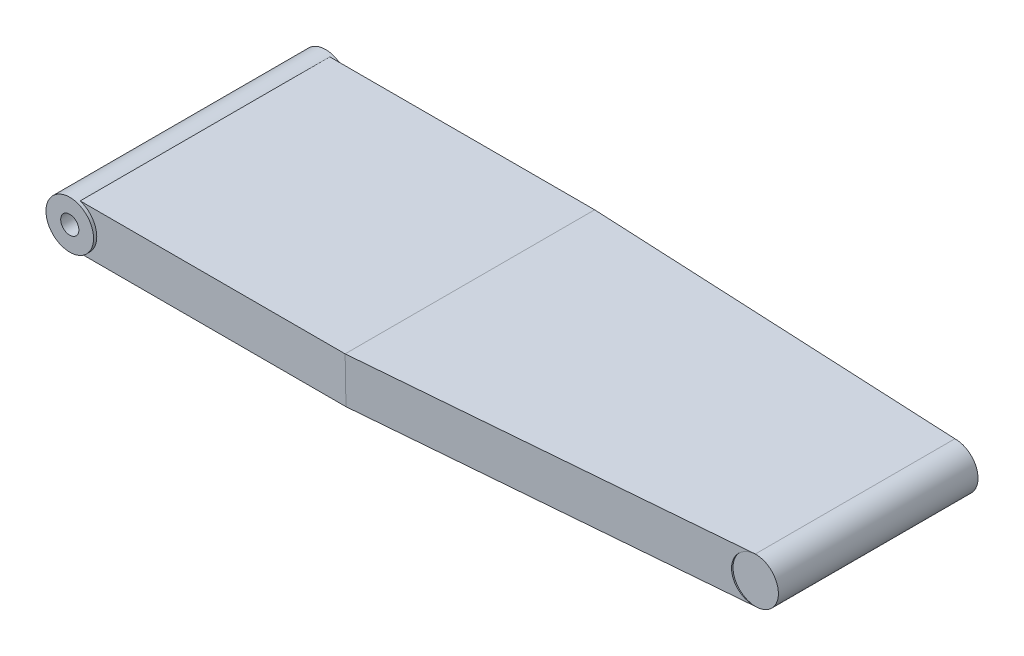
ISO-10303-21;
HEADER;
FILE_DESCRIPTION(('STEP AP214'),'2;1');
FILE_NAME('part.step','',(''),(''),'','','');
FILE_SCHEMA(('AUTOMOTIVE_DESIGN { 1 0 10303 214 1 1 1 1 }'));
ENDSEC;
DATA;
#1=APPLICATION_CONTEXT('core data for automotive mechanical design processes');
#2=APPLICATION_PROTOCOL_DEFINITION('international standard','automotive_design',2000,#1);
#3=PRODUCT_CONTEXT('',#1,'mechanical');
#4=PRODUCT('Part','Part','',(#3));
#5=PRODUCT_RELATED_PRODUCT_CATEGORY('part','',(#4));
#6=PRODUCT_DEFINITION_FORMATION('','',#4);
#7=PRODUCT_DEFINITION_CONTEXT('part definition',#1,'design');
#8=PRODUCT_DEFINITION('design','',#6,#7);
#9=PRODUCT_DEFINITION_SHAPE('','',#8);
#10=(LENGTH_UNIT() NAMED_UNIT(*) SI_UNIT(.MILLI.,.METRE.));
#11=(NAMED_UNIT(*) PLANE_ANGLE_UNIT() SI_UNIT($,.RADIAN.));
#12=(NAMED_UNIT(*) SI_UNIT($,.STERADIAN.) SOLID_ANGLE_UNIT());
#13=UNCERTAINTY_MEASURE_WITH_UNIT(LENGTH_MEASURE(1.E-05),#10,'distance_accuracy_value','');
#14=(GEOMETRIC_REPRESENTATION_CONTEXT(3) GLOBAL_UNCERTAINTY_ASSIGNED_CONTEXT((#13)) GLOBAL_UNIT_ASSIGNED_CONTEXT((#10,
#11,#12)) REPRESENTATION_CONTEXT('',''));
#15=CARTESIAN_POINT('',(0.,0.,0.));
#16=DIRECTION('',(0.,0.,1.));
#17=DIRECTION('',(1.,0.,0.));
#18=AXIS2_PLACEMENT_3D('',#15,#16,#17);
#19=CARTESIAN_POINT('',(145.,1.50077929514975,22.));
#20=DIRECTION('',(0.,0.,-1.));
#21=DIRECTION('',(-1.,0.,0.));
#22=AXIS2_PLACEMENT_3D('',#19,#20,#21);
#23=CYLINDRICAL_SURFACE('',#22,5.00000000000002);
#24=DIRECTION('',(0.,0.,-1.));
#25=VECTOR('',#24,1.);
#26=CARTESIAN_POINT('',(144.911732622259,6.50000012144126,27.5));
#27=LINE('',#26,#25);
#28=CARTESIAN_POINT('',(144.911732622259,6.50000012144126,22.));
#29=VERTEX_POINT('',#28);
#30=CARTESIAN_POINT('',(144.911732622259,6.50000012144126,-22.));
#31=VERTEX_POINT('',#30);
#32=EDGE_CURVE('E126',#29,#31,#27,.T.);
#33=ORIENTED_EDGE('',*,*,#32,.F.);
#34=CARTESIAN_POINT('',(145.,1.50077929514975,22.));
#35=DIRECTION('',(0.,0.,1.));
#36=DIRECTION('',(1.,0.,0.));
#37=AXIS2_PLACEMENT_3D('',#34,#35,#36);
#38=CIRCLE('',#37,5.00000000000002);
#39=CARTESIAN_POINT('',(145.088267377741,-3.49844153114175,22.));
#40=VERTEX_POINT('',#39);
#41=EDGE_CURVE('E171',#40,#29,#38,.T.);
#42=ORIENTED_EDGE('',*,*,#41,.F.);
#43=DIRECTION('',(0.,0.,-1.));
#44=VECTOR('',#43,1.);
#45=CARTESIAN_POINT('',(145.088267377741,-3.49844153114175,27.5));
#46=LINE('',#45,#44);
#47=CARTESIAN_POINT('',(145.088267377741,-3.49844153114175,-22.));
#48=VERTEX_POINT('',#47);
#49=EDGE_CURVE('E161',#40,#48,#46,.T.);
#50=ORIENTED_EDGE('',*,*,#49,.T.);
#51=CARTESIAN_POINT('',(145.,1.50077929514975,-22.));
#52=DIRECTION('',(0.,0.,1.));
#53=DIRECTION('',(1.,0.,0.));
#54=AXIS2_PLACEMENT_3D('',#51,#52,#53);
#55=CIRCLE('',#54,5.00000000000002);
#56=EDGE_CURVE('E167',#48,#31,#55,.T.);
#57=ORIENTED_EDGE('',*,*,#56,.T.);
#58=EDGE_LOOP('',(#33,#42,#50,#57));
#59=FACE_BOUND('',#58,.T.);
#60=ADVANCED_FACE('F48',(#59),#23,.T.);
#61=CARTESIAN_POINT('',(0.,0.,22.));
#62=DIRECTION('',(0.,0.,1.));
#63=DIRECTION('',(1.,0.,0.));
#64=AXIS2_PLACEMENT_3D('',#61,#62,#63);
#65=PLANE('',#64);
#66=ORIENTED_EDGE('',*,*,#41,.T.);
#67=EDGE_CURVE('E168',#29,#40,#38,.T.);
#68=ORIENTED_EDGE('',*,*,#67,.T.);
#69=EDGE_LOOP('',(#66,#68));
#70=FACE_BOUND('',#69,.T.);
#71=ADVANCED_FACE('F209',(#70),#65,.T.);
#72=CARTESIAN_POINT('',(0.,0.,-22.));
#73=DIRECTION('',(0.,0.,1.));
#74=DIRECTION('',(1.,0.,0.));
#75=AXIS2_PLACEMENT_3D('',#72,#73,#74);
#76=PLANE('',#75);
#77=EDGE_CURVE('E172',#31,#48,#55,.T.);
#78=ORIENTED_EDGE('',*,*,#77,.F.);
#79=ORIENTED_EDGE('',*,*,#56,.F.);
#80=EDGE_LOOP('',(#78,#79));
#81=FACE_BOUND('',#80,.T.);
#82=ADVANCED_FACE('F196',(#81),#76,.F.);
#83=CARTESIAN_POINT('',(145.,1.50077929514975,27.5));
#84=DIRECTION('',(0.,0.,-1.));
#85=DIRECTION('',(-1.,0.,0.));
#86=AXIS2_PLACEMENT_3D('',#83,#84,#85);
#87=CYLINDRICAL_SURFACE('',#86,5.00000000000002);
#88=CARTESIAN_POINT('',(145.,1.50077929514975,-22.));
#89=DIRECTION('',(-0.0646175896619117,-0.00114090283137741,0.997909447518669));
#90=DIRECTION('',(-0.997753938557676,-0.0176165700310762,-0.0646276608967542));
#91=AXIS2_PLACEMENT_3D('',#88,#89,#90);
#92=ELLIPSE('',#91,5.01047466023362,5.00000000000002);
#93=EDGE_CURVE('E191',#31,#48,#92,.T.);
#94=ORIENTED_EDGE('',*,*,#93,.F.);
#95=ORIENTED_EDGE('',*,*,#77,.T.);
#96=EDGE_LOOP('',(#94,#95));
#97=FACE_BOUND('',#96,.T.);
#98=ADVANCED_FACE('F201',(#97),#87,.F.);
#99=CARTESIAN_POINT('',(145.,1.50077929514975,22.));
#100=DIRECTION('',(-0.0646175896619117,-0.00114090283137741,-0.997909447518669));
#101=DIRECTION('',(0.997753938557676,0.0176165700310762,-0.0646276608967542));
#102=AXIS2_PLACEMENT_3D('',#99,#100,#101);
#103=ELLIPSE('',#102,5.01047466023362,5.00000000000002);
#104=EDGE_CURVE('E183',#40,#29,#103,.T.);
#105=ORIENTED_EDGE('',*,*,#104,.F.);
#106=ORIENTED_EDGE('',*,*,#67,.F.);
#107=EDGE_LOOP('',(#105,#106));
#108=FACE_BOUND('',#107,.T.);
#109=ADVANCED_FACE('F210',(#108),#87,.F.);
#110=CARTESIAN_POINT('',(-0.0695686658051106,3.94017735488838,27.5));
#111=DIRECTION('',(-0.0176534755481876,0.999844165258302,0.));
#112=DIRECTION('',(-0.999844165258301,-0.0176534755481876,0.));
#113=AXIS2_PLACEMENT_3D('',#110,#111,#112);
#114=PLANE('',#113);
#115=DIRECTION('',(0.997753938557676,0.0176165700310762,0.0646276608967542));
#116=VECTOR('',#115,1.);
#117=CARTESIAN_POINT('',(60.,5.00077929514975,-27.5));
#118=LINE('',#117,#116);
#119=CARTESIAN_POINT('',(60.,5.00077929514975,-27.5));
#120=VERTEX_POINT('',#119);
#121=EDGE_CURVE('E113',#120,#31,#118,.T.);
#122=ORIENTED_EDGE('',*,*,#121,.F.);
#123=DIRECTION('',(0.,0.,-1.));
#124=VECTOR('',#123,1.);
#125=CARTESIAN_POINT('',(60.,5.00077929514975,27.5));
#126=LINE('',#125,#124);
#127=CARTESIAN_POINT('',(60.,5.00077929514975,27.5));
#128=VERTEX_POINT('',#127);
#129=EDGE_CURVE('E123',#128,#120,#126,.T.);
#130=ORIENTED_EDGE('',*,*,#129,.F.);
#131=DIRECTION('',(-0.997753938557676,-0.0176165700310762,0.0646276608967542));
#132=VECTOR('',#131,1.);
#133=CARTESIAN_POINT('',(60.,5.00077929514975,27.5));
#134=LINE('',#133,#132);
#135=EDGE_CURVE('E179',#29,#128,#134,.T.);
#136=ORIENTED_EDGE('',*,*,#135,.F.);
#137=ORIENTED_EDGE('',*,*,#32,.T.);
#138=EDGE_LOOP('',(#122,#130,#136,#137));
#139=FACE_BOUND('',#138,.T.);
#140=ADVANCED_FACE('F121',(#139),#114,.T.);
#141=CARTESIAN_POINT('',(0.106966089676766,-6.05826429769463,27.5));
#142=DIRECTION('',(-0.0176534755481876,0.999844165258302,0.));
#143=DIRECTION('',(-0.999844165258301,-0.0176534755481876,0.));
#144=AXIS2_PLACEMENT_3D('',#141,#142,#143);
#145=PLANE('',#144);
#146=DIRECTION('',(0.999844165258301,0.0176534755481876,0.));
#147=VECTOR('',#146,1.);
#148=CARTESIAN_POINT('',(0.106966089676766,-6.05826429769463,-27.5));
#149=LINE('',#148,#147);
#150=CARTESIAN_POINT('',(60.,-5.00077929514975,-27.5));
#151=VERTEX_POINT('',#150);
#152=CARTESIAN_POINT('',(60.1765347554818,-4.99766235743326,-27.5));
#153=VERTEX_POINT('',#152);
#154=EDGE_CURVE('E157',#151,#153,#149,.T.);
#155=ORIENTED_EDGE('',*,*,#154,.T.);
#156=DIRECTION('',(0.997753938557676,0.0176165700310762,0.0646276608967542));
#157=VECTOR('',#156,1.);
#158=CARTESIAN_POINT('',(3.90439840867904,-5.9912159706465,-31.1449232673681));
#159=LINE('',#158,#157);
#160=EDGE_CURVE('E62',#153,#48,#159,.T.);
#161=ORIENTED_EDGE('',*,*,#160,.T.);
#162=ORIENTED_EDGE('',*,*,#49,.F.);
#163=DIRECTION('',(-0.997753938557676,-0.0176165700310762,0.0646276608967542));
#164=VECTOR('',#163,1.);
#165=CARTESIAN_POINT('',(0.35786073270619,-6.05383444492378,31.3746436677824));
#166=LINE('',#165,#164);
#167=CARTESIAN_POINT('',(60.1765347554819,-4.99766235743326,27.5));
#168=VERTEX_POINT('',#167);
#169=EDGE_CURVE('E177',#40,#168,#166,.T.);
#170=ORIENTED_EDGE('',*,*,#169,.T.);
#171=DIRECTION('',(0.999844165258301,0.0176534755481876,0.));
#172=VECTOR('',#171,1.);
#173=CARTESIAN_POINT('',(0.106966089676766,-6.05826429769463,27.5));
#174=LINE('',#173,#172);
#175=CARTESIAN_POINT('',(60.,-5.00077929514975,27.5));
#176=VERTEX_POINT('',#175);
#177=EDGE_CURVE('E70',#176,#168,#174,.T.);
#178=ORIENTED_EDGE('',*,*,#177,.F.);
#179=DIRECTION('',(0.,0.,-1.));
#180=VECTOR('',#179,1.);
#181=CARTESIAN_POINT('',(60.,-5.00077929514975,27.5));
#182=LINE('',#181,#180);
#183=EDGE_CURVE('E79',#176,#151,#182,.T.);
#184=ORIENTED_EDGE('',*,*,#183,.T.);
#185=EDGE_LOOP('',(#155,#161,#162,#170,#178,#184));
#186=FACE_BOUND('',#185,.T.);
#187=ADVANCED_FACE('F182',(#186),#145,.F.);
#188=CARTESIAN_POINT('',(0.,0.,27.5));
#189=DIRECTION('',(0.,0.,1.));
#190=DIRECTION('',(1.,0.,0.));
#191=AXIS2_PLACEMENT_3D('',#188,#189,#190);
#192=PLANE('',#191);
#193=DIRECTION('',(0.0176534755481876,-0.999844165258301,0.));
#194=VECTOR('',#193,1.);
#195=CARTESIAN_POINT('',(60.0695686658051,1.06060194026137,27.5));
#196=LINE('',#195,#194);
#197=EDGE_CURVE('E55',#128,#168,#196,.T.);
#198=ORIENTED_EDGE('',*,*,#197,.F.);
#199=DIRECTION('',(1.,0.,0.));
#200=VECTOR('',#199,1.);
#201=CARTESIAN_POINT('',(0.,5.00077929514975,27.5));
#202=LINE('',#201,#200);
#203=CARTESIAN_POINT('',(1.5983449068338,5.00077929514975,27.5));
#204=VERTEX_POINT('',#203);
#205=EDGE_CURVE('E135',#204,#128,#202,.T.);
#206=ORIENTED_EDGE('',*,*,#205,.F.);
#207=CARTESIAN_POINT('',(0.,0.,27.5));
#208=DIRECTION('',(0.,0.,1.));
#209=DIRECTION('',(1.,0.,0.));
#210=AXIS2_PLACEMENT_3D('',#207,#208,#209);
#211=CIRCLE('',#210,5.25);
#212=CARTESIAN_POINT('',(1.5983449068338,-5.00077929514975,27.5));
#213=VERTEX_POINT('',#212);
#214=EDGE_CURVE('E141',#213,#204,#211,.T.);
#215=ORIENTED_EDGE('',*,*,#214,.F.);
#216=DIRECTION('',(1.,0.,0.));
#217=VECTOR('',#216,1.);
#218=CARTESIAN_POINT('',(0.,-5.00077929514975,27.5));
#219=LINE('',#218,#217);
#220=EDGE_CURVE('E144',#213,#176,#219,.T.);
#221=ORIENTED_EDGE('',*,*,#220,.T.);
#222=ORIENTED_EDGE('',*,*,#177,.T.);
#223=EDGE_LOOP('',(#198,#206,#215,#221,#222));
#224=FACE_BOUND('',#223,.T.);
#225=ADVANCED_FACE('F185',(#224),#192,.T.);
#226=CARTESIAN_POINT('',(0.,0.,-27.5));
#227=DIRECTION('',(0.,0.,1.));
#228=DIRECTION('',(1.,0.,0.));
#229=AXIS2_PLACEMENT_3D('',#226,#227,#228);
#230=PLANE('',#229);
#231=DIRECTION('',(1.,0.,0.));
#232=VECTOR('',#231,1.);
#233=CARTESIAN_POINT('',(0.,5.00077929514975,-27.5));
#234=LINE('',#233,#232);
#235=CARTESIAN_POINT('',(1.5983449068338,5.00077929514975,-27.5));
#236=VERTEX_POINT('',#235);
#237=EDGE_CURVE('E133',#236,#120,#234,.T.);
#238=ORIENTED_EDGE('',*,*,#237,.T.);
#239=DIRECTION('',(0.0176534755481876,-0.999844165258301,0.));
#240=VECTOR('',#239,1.);
#241=CARTESIAN_POINT('',(60.0695686658051,1.06060194026137,-27.5));
#242=LINE('',#241,#240);
#243=EDGE_CURVE('E13',#120,#153,#242,.T.);
#244=ORIENTED_EDGE('',*,*,#243,.T.);
#245=ORIENTED_EDGE('',*,*,#154,.F.);
#246=DIRECTION('',(1.,0.,0.));
#247=VECTOR('',#246,1.);
#248=CARTESIAN_POINT('',(0.,-5.00077929514975,-27.5));
#249=LINE('',#248,#247);
#250=CARTESIAN_POINT('',(1.5983449068338,-5.00077929514975,-27.5));
#251=VERTEX_POINT('',#250);
#252=EDGE_CURVE('E142',#251,#151,#249,.T.);
#253=ORIENTED_EDGE('',*,*,#252,.F.);
#254=CARTESIAN_POINT('',(0.,0.,-27.5));
#255=DIRECTION('',(0.,0.,1.));
#256=DIRECTION('',(1.,0.,0.));
#257=AXIS2_PLACEMENT_3D('',#254,#255,#256);
#258=CIRCLE('',#257,5.25);
#259=EDGE_CURVE('E140',#251,#236,#258,.T.);
#260=ORIENTED_EDGE('',*,*,#259,.T.);
#261=EDGE_LOOP('',(#238,#244,#245,#253,#260));
#262=FACE_BOUND('',#261,.T.);
#263=ADVANCED_FACE('F138',(#262),#230,.F.);
#264=CARTESIAN_POINT('',(0.,0.,28.2));
#265=DIRECTION('',(0.,0.,-1.));
#266=DIRECTION('',(-1.,0.,0.));
#267=AXIS2_PLACEMENT_3D('',#264,#265,#266);
#268=CYLINDRICAL_SURFACE('',#267,5.25);
#269=DIRECTION('',(0.,0.,-1.));
#270=VECTOR('',#269,1.);
#271=CARTESIAN_POINT('',(1.5983449068338,-5.00077929514975,27.5));
#272=LINE('',#271,#270);
#273=EDGE_CURVE('E87',#213,#251,#272,.T.);
#274=ORIENTED_EDGE('',*,*,#273,.F.);
#275=ORIENTED_EDGE('',*,*,#214,.T.);
#276=DIRECTION('',(0.,0.,-1.));
#277=VECTOR('',#276,1.);
#278=CARTESIAN_POINT('',(1.5983449068338,5.00077929514975,27.5));
#279=LINE('',#278,#277);
#280=EDGE_CURVE('E150',#204,#236,#279,.T.);
#281=ORIENTED_EDGE('',*,*,#280,.T.);
#282=ORIENTED_EDGE('',*,*,#259,.F.);
#283=EDGE_LOOP('',(#274,#275,#281,#282));
#284=FACE_BOUND('',#283,.T.);
#285=CARTESIAN_POINT('',(0.,0.,28.2));
#286=DIRECTION('',(0.,0.,1.));
#287=DIRECTION('',(1.,0.,0.));
#288=AXIS2_PLACEMENT_3D('',#285,#286,#287);
#289=CIRCLE('',#288,5.25);
#290=CARTESIAN_POINT('',(5.25,0.,28.2));
#291=VERTEX_POINT('',#290);
#292=EDGE_CURVE('E154',#291,#291,#289,.T.);
#293=ORIENTED_EDGE('',*,*,#292,.F.);
#294=EDGE_LOOP('',(#293));
#295=FACE_BOUND('',#294,.T.);
#296=CARTESIAN_POINT('',(0.,0.,-28.2));
#297=DIRECTION('',(0.,0.,1.));
#298=DIRECTION('',(1.,0.,0.));
#299=AXIS2_PLACEMENT_3D('',#296,#297,#298);
#300=CIRCLE('',#299,5.25);
#301=CARTESIAN_POINT('',(5.25,0.,-28.2));
#302=VERTEX_POINT('',#301);
#303=EDGE_CURVE('E153',#302,#302,#300,.T.);
#304=ORIENTED_EDGE('',*,*,#303,.T.);
#305=EDGE_LOOP('',(#304));
#306=FACE_BOUND('',#305,.T.);
#307=ADVANCED_FACE('F280',(#284,#295,#306),#268,.T.);
#308=CARTESIAN_POINT('',(0.,0.,28.2));
#309=DIRECTION('',(0.,0.,1.));
#310=DIRECTION('',(1.,0.,0.));
#311=AXIS2_PLACEMENT_3D('',#308,#309,#310);
#312=PLANE('',#311);
#313=CARTESIAN_POINT('',(0.,0.,28.2));
#314=DIRECTION('',(0.,0.,1.));
#315=DIRECTION('',(1.,0.,0.));
#316=AXIS2_PLACEMENT_3D('',#313,#314,#315);
#317=CIRCLE('',#316,2.);
#318=CARTESIAN_POINT('',(2.,0.,28.2));
#319=VERTEX_POINT('',#318);
#320=EDGE_CURVE('E392',#319,#319,#317,.T.);
#321=ORIENTED_EDGE('',*,*,#320,.F.);
#322=EDGE_LOOP('',(#321));
#323=FACE_BOUND('',#322,.T.);
#324=ORIENTED_EDGE('',*,*,#292,.T.);
#325=EDGE_LOOP('',(#324));
#326=FACE_BOUND('',#325,.T.);
#327=ADVANCED_FACE('F313',(#323,#326),#312,.T.);
#328=CARTESIAN_POINT('',(0.,0.,-28.2));
#329=DIRECTION('',(0.,0.,1.));
#330=DIRECTION('',(1.,0.,0.));
#331=AXIS2_PLACEMENT_3D('',#328,#329,#330);
#332=PLANE('',#331);
#333=CARTESIAN_POINT('',(0.,0.,-28.2));
#334=DIRECTION('',(0.,0.,1.));
#335=DIRECTION('',(1.,0.,0.));
#336=AXIS2_PLACEMENT_3D('',#333,#334,#335);
#337=CIRCLE('',#336,2.);
#338=CARTESIAN_POINT('',(2.,0.,-28.2));
#339=VERTEX_POINT('',#338);
#340=EDGE_CURVE('E127',#339,#339,#337,.T.);
#341=ORIENTED_EDGE('',*,*,#340,.T.);
#342=EDGE_LOOP('',(#341));
#343=FACE_BOUND('',#342,.T.);
#344=ORIENTED_EDGE('',*,*,#303,.F.);
#345=EDGE_LOOP('',(#344));
#346=FACE_BOUND('',#345,.T.);
#347=ADVANCED_FACE('F319',(#343,#346),#332,.F.);
#348=CARTESIAN_POINT('',(0.,-5.00077929514975,27.5));
#349=DIRECTION('',(0.,1.,0.));
#350=DIRECTION('',(-1.,0.,0.));
#351=AXIS2_PLACEMENT_3D('',#348,#349,#350);
#352=PLANE('',#351);
#353=ORIENTED_EDGE('',*,*,#252,.T.);
#354=ORIENTED_EDGE('',*,*,#183,.F.);
#355=ORIENTED_EDGE('',*,*,#220,.F.);
#356=ORIENTED_EDGE('',*,*,#273,.T.);
#357=EDGE_LOOP('',(#353,#354,#355,#356));
#358=FACE_BOUND('',#357,.T.);
#359=ADVANCED_FACE('F189',(#358),#352,.F.);
#360=CARTESIAN_POINT('',(0.,5.00077929514975,27.5));
#361=DIRECTION('',(0.,1.,0.));
#362=DIRECTION('',(-1.,0.,0.));
#363=AXIS2_PLACEMENT_3D('',#360,#361,#362);
#364=PLANE('',#363);
#365=ORIENTED_EDGE('',*,*,#237,.F.);
#366=ORIENTED_EDGE('',*,*,#280,.F.);
#367=ORIENTED_EDGE('',*,*,#205,.T.);
#368=ORIENTED_EDGE('',*,*,#129,.T.);
#369=EDGE_LOOP('',(#365,#366,#367,#368));
#370=FACE_BOUND('',#369,.T.);
#371=ADVANCED_FACE('F131',(#370),#364,.T.);
#372=CARTESIAN_POINT('',(60.2089817493924,-6.83537060095207,27.5));
#373=DIRECTION('',(-0.0646175896619117,-0.00114090283137741,-0.997909447518669));
#374=DIRECTION('',(-0.997910096988344,0.,0.0646176317169951));
#375=AXIS2_PLACEMENT_3D('',#372,#373,#374);
#376=PLANE('',#375);
#377=ORIENTED_EDGE('',*,*,#104,.T.);
#378=ORIENTED_EDGE('',*,*,#135,.T.);
#379=ORIENTED_EDGE('',*,*,#197,.T.);
#380=ORIENTED_EDGE('',*,*,#169,.F.);
#381=EDGE_LOOP('',(#377,#378,#379,#380));
#382=FACE_BOUND('',#381,.T.);
#383=ADVANCED_FACE('F176',(#382),#376,.F.);
#384=CARTESIAN_POINT('',(60.2089817493924,-6.83537060095207,-27.5));
#385=DIRECTION('',(-0.0646175896619117,-0.00114090283137741,0.997909447518669));
#386=DIRECTION('',(0.997910096988344,0.,0.0646176317169951));
#387=AXIS2_PLACEMENT_3D('',#384,#385,#386);
#388=PLANE('',#387);
#389=ORIENTED_EDGE('',*,*,#93,.T.);
#390=ORIENTED_EDGE('',*,*,#160,.F.);
#391=ORIENTED_EDGE('',*,*,#243,.F.);
#392=ORIENTED_EDGE('',*,*,#121,.T.);
#393=EDGE_LOOP('',(#389,#390,#391,#392));
#394=FACE_BOUND('',#393,.T.);
#395=ADVANCED_FACE('F112',(#394),#388,.F.);
#396=CARTESIAN_POINT('',(0.,0.,-28.2));
#397=DIRECTION('',(0.,0.,1.));
#398=DIRECTION('',(1.,0.,0.));
#399=AXIS2_PLACEMENT_3D('',#396,#397,#398);
#400=CYLINDRICAL_SURFACE('',#399,2.);
#401=ORIENTED_EDGE('',*,*,#340,.F.);
#402=EDGE_LOOP('',(#401));
#403=FACE_BOUND('',#402,.T.);
#404=ORIENTED_EDGE('',*,*,#320,.T.);
#405=EDGE_LOOP('',(#404));
#406=FACE_BOUND('',#405,.T.);
#407=ADVANCED_FACE('F306',(#403,#406),#400,.F.);
#408=CLOSED_SHELL('',(#60,#71,#82,#98,#109,#140,#187,#225,#263,#307,#327,#347,#359,#371,#383,
#395,#407));
#409=MANIFOLD_SOLID_BREP('B2',#408);
#410=ADVANCED_BREP_SHAPE_REPRESENTATION('',(#18,#409),#14);
#411=SHAPE_DEFINITION_REPRESENTATION(#9,#410);
ENDSEC;
END-ISO-10303-21;
